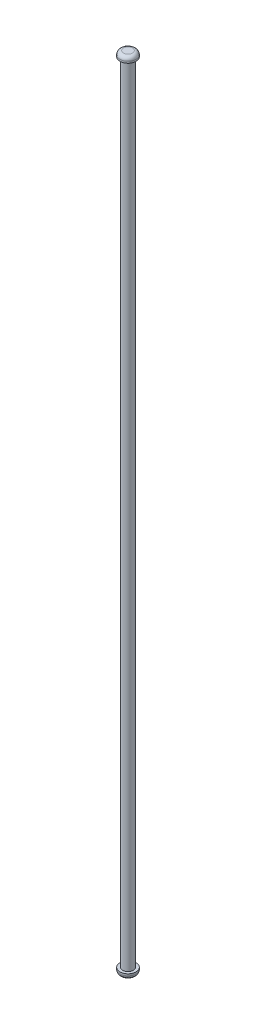
ISO-10303-21;
HEADER;
FILE_DESCRIPTION(('STEP AP214'),'2;1');
FILE_NAME('part.step','',(''),(''),'','','');
FILE_SCHEMA(('AUTOMOTIVE_DESIGN { 1 0 10303 214 1 1 1 1 }'));
ENDSEC;
DATA;
#1=APPLICATION_CONTEXT('core data for automotive mechanical design processes');
#2=APPLICATION_PROTOCOL_DEFINITION('international standard','automotive_design',2000,#1);
#3=PRODUCT_CONTEXT('',#1,'mechanical');
#4=PRODUCT('Part','Part','',(#3));
#5=PRODUCT_RELATED_PRODUCT_CATEGORY('part','',(#4));
#6=PRODUCT_DEFINITION_FORMATION('','',#4);
#7=PRODUCT_DEFINITION_CONTEXT('part definition',#1,'design');
#8=PRODUCT_DEFINITION('design','',#6,#7);
#9=PRODUCT_DEFINITION_SHAPE('','',#8);
#10=(LENGTH_UNIT() NAMED_UNIT(*) SI_UNIT(.MILLI.,.METRE.));
#11=(NAMED_UNIT(*) PLANE_ANGLE_UNIT() SI_UNIT($,.RADIAN.));
#12=(NAMED_UNIT(*) SI_UNIT($,.STERADIAN.) SOLID_ANGLE_UNIT());
#13=UNCERTAINTY_MEASURE_WITH_UNIT(LENGTH_MEASURE(1.E-05),#10,'distance_accuracy_value','');
#14=(GEOMETRIC_REPRESENTATION_CONTEXT(3) GLOBAL_UNCERTAINTY_ASSIGNED_CONTEXT((#13)) GLOBAL_UNIT_ASSIGNED_CONTEXT((#10,
#11,#12)) REPRESENTATION_CONTEXT('',''));
#15=CARTESIAN_POINT('',(0.,0.,0.));
#16=DIRECTION('',(0.,0.,1.));
#17=DIRECTION('',(1.,0.,0.));
#18=AXIS2_PLACEMENT_3D('',#15,#16,#17);
#19=CARTESIAN_POINT('',(-4.44089209850063E-13,224.,0.));
#20=DIRECTION('',(0.,-1.,0.));
#21=DIRECTION('',(0.,0.,-1.));
#22=AXIS2_PLACEMENT_3D('',#19,#20,#21);
#23=CYLINDRICAL_SURFACE('',#22,1.5);
#24=CARTESIAN_POINT('',(0.,222.5,0.));
#25=DIRECTION('',(0.,1.,0.));
#26=DIRECTION('',(0.,0.,1.));
#27=AXIS2_PLACEMENT_3D('',#24,#25,#26);
#28=CIRCLE('',#27,1.5);
#29=CARTESIAN_POINT('',(0.,222.5,1.5));
#30=VERTEX_POINT('',#29);
#31=EDGE_CURVE('E62',#30,#30,#28,.T.);
#32=ORIENTED_EDGE('',*,*,#31,.F.);
#33=EDGE_LOOP('',(#32));
#34=FACE_BOUND('',#33,.T.);
#35=CARTESIAN_POINT('',(-4.44089209850063E-13,1.50000000000006,0.));
#36=DIRECTION('',(0.,-1.,0.));
#37=DIRECTION('',(0.,0.,-1.));
#38=AXIS2_PLACEMENT_3D('',#35,#36,#37);
#39=CIRCLE('',#38,1.5);
#40=CARTESIAN_POINT('',(-4.44089209850063E-13,1.50000000000006,-1.5));
#41=VERTEX_POINT('',#40);
#42=EDGE_CURVE('E50',#41,#41,#39,.T.);
#43=ORIENTED_EDGE('',*,*,#42,.F.);
#44=EDGE_LOOP('',(#43));
#45=FACE_BOUND('',#44,.T.);
#46=ADVANCED_FACE('F39',(#34,#45),#23,.T.);
#47=CARTESIAN_POINT('',(0.,222.5,0.));
#48=DIRECTION('',(0.,1.,0.));
#49=DIRECTION('',(0.,0.,1.));
#50=AXIS2_PLACEMENT_3D('',#47,#48,#49);
#51=CYLINDRICAL_SURFACE('',#50,2.25);
#52=CARTESIAN_POINT('',(0.,223.,0.));
#53=DIRECTION('',(0.,1.,0.));
#54=DIRECTION('',(0.,0.,1.));
#55=AXIS2_PLACEMENT_3D('',#52,#53,#54);
#56=CIRCLE('',#55,2.25);
#57=CARTESIAN_POINT('',(0.,223.,2.25));
#58=VERTEX_POINT('',#57);
#59=EDGE_CURVE('E54',#58,#58,#56,.F.);
#60=ORIENTED_EDGE('',*,*,#59,.T.);
#61=EDGE_LOOP('',(#60));
#62=FACE_BOUND('',#61,.T.);
#63=CARTESIAN_POINT('',(0.,222.5,0.));
#64=DIRECTION('',(0.,1.,0.));
#65=DIRECTION('',(0.,0.,1.));
#66=AXIS2_PLACEMENT_3D('',#63,#64,#65);
#67=CIRCLE('',#66,2.25);
#68=CARTESIAN_POINT('',(0.,222.5,2.25));
#69=VERTEX_POINT('',#68);
#70=EDGE_CURVE('E65',#69,#69,#67,.T.);
#71=ORIENTED_EDGE('',*,*,#70,.T.);
#72=EDGE_LOOP('',(#71));
#73=FACE_BOUND('',#72,.T.);
#74=ADVANCED_FACE('F88',(#62,#73),#51,.T.);
#75=CARTESIAN_POINT('',(0.,222.5,0.));
#76=DIRECTION('',(0.,1.,0.));
#77=DIRECTION('',(0.,0.,1.));
#78=AXIS2_PLACEMENT_3D('',#75,#76,#77);
#79=PLANE('',#78);
#80=ORIENTED_EDGE('',*,*,#31,.T.);
#81=EDGE_LOOP('',(#80));
#82=FACE_BOUND('',#81,.T.);
#83=ORIENTED_EDGE('',*,*,#70,.F.);
#84=EDGE_LOOP('',(#83));
#85=FACE_BOUND('',#84,.T.);
#86=ADVANCED_FACE('F96',(#82,#85),#79,.F.);
#87=CARTESIAN_POINT('',(-4.44089209850063E-13,224.,0.));
#88=DIRECTION('',(0.,1.,0.));
#89=DIRECTION('',(0.,0.,1.));
#90=AXIS2_PLACEMENT_3D('',#87,#88,#89);
#91=PLANE('',#90);
#92=CARTESIAN_POINT('',(-4.44089209850063E-13,224.,0.));
#93=DIRECTION('',(0.,1.,0.));
#94=DIRECTION('',(0.,0.,1.));
#95=AXIS2_PLACEMENT_3D('',#92,#93,#94);
#96=CIRCLE('',#95,1.25);
#97=CARTESIAN_POINT('',(-4.44089209850063E-13,224.,1.25));
#98=VERTEX_POINT('',#97);
#99=EDGE_CURVE('E59',#98,#98,#96,.T.);
#100=ORIENTED_EDGE('',*,*,#99,.T.);
#101=EDGE_LOOP('',(#100));
#102=FACE_BOUND('',#101,.T.);
#103=ADVANCED_FACE('F102',(#102),#91,.T.);
#104=CARTESIAN_POINT('',(0.,223.,0.));
#105=DIRECTION('',(0.,1.,0.));
#106=DIRECTION('',(0.,0.,1.));
#107=AXIS2_PLACEMENT_3D('',#104,#105,#106);
#108=TOROIDAL_SURFACE('',#107,1.25,1.);
#109=ORIENTED_EDGE('',*,*,#59,.F.);
#110=EDGE_LOOP('',(#109));
#111=FACE_BOUND('',#110,.T.);
#112=ORIENTED_EDGE('',*,*,#99,.F.);
#113=EDGE_LOOP('',(#112));
#114=FACE_BOUND('',#113,.T.);
#115=ADVANCED_FACE('F85',(#111,#114),#108,.T.);
#116=CARTESIAN_POINT('',(-4.44089209850063E-13,1.49999999999995,0.));
#117=DIRECTION('',(0.,-1.,0.));
#118=DIRECTION('',(0.,0.,-1.));
#119=AXIS2_PLACEMENT_3D('',#116,#117,#118);
#120=CYLINDRICAL_SURFACE('',#119,2.25);
#121=CARTESIAN_POINT('',(-4.44089209850063E-13,1.,0.));
#122=DIRECTION('',(0.,1.,0.));
#123=DIRECTION('',(0.,0.,1.));
#124=AXIS2_PLACEMENT_3D('',#121,#122,#123);
#125=CIRCLE('',#124,2.25);
#126=CARTESIAN_POINT('',(-4.44089209850063E-13,1.,2.25));
#127=VERTEX_POINT('',#126);
#128=EDGE_CURVE('E10',#127,#127,#125,.T.);
#129=ORIENTED_EDGE('',*,*,#128,.T.);
#130=EDGE_LOOP('',(#129));
#131=FACE_BOUND('',#130,.T.);
#132=CARTESIAN_POINT('',(-4.44089209850063E-13,1.49999999999995,0.));
#133=DIRECTION('',(0.,-1.,0.));
#134=DIRECTION('',(0.,0.,-1.));
#135=AXIS2_PLACEMENT_3D('',#132,#133,#134);
#136=CIRCLE('',#135,2.25);
#137=CARTESIAN_POINT('',(-4.44089209850063E-13,1.49999999999995,-2.25));
#138=VERTEX_POINT('',#137);
#139=EDGE_CURVE('E68',#138,#138,#136,.T.);
#140=ORIENTED_EDGE('',*,*,#139,.T.);
#141=EDGE_LOOP('',(#140));
#142=FACE_BOUND('',#141,.T.);
#143=ADVANCED_FACE('F72',(#131,#142),#120,.T.);
#144=CARTESIAN_POINT('',(-4.44089209850063E-13,1.49999999999995,0.));
#145=DIRECTION('',(0.,-1.,0.));
#146=DIRECTION('',(0.,0.,-1.));
#147=AXIS2_PLACEMENT_3D('',#144,#145,#146);
#148=PLANE('',#147);
#149=ORIENTED_EDGE('',*,*,#42,.T.);
#150=EDGE_LOOP('',(#149));
#151=FACE_BOUND('',#150,.T.);
#152=ORIENTED_EDGE('',*,*,#139,.F.);
#153=EDGE_LOOP('',(#152));
#154=FACE_BOUND('',#153,.T.);
#155=ADVANCED_FACE('F74',(#151,#154),#148,.F.);
#156=CARTESIAN_POINT('',(0.,0.,0.));
#157=DIRECTION('',(0.,1.,0.));
#158=DIRECTION('',(0.,0.,1.));
#159=AXIS2_PLACEMENT_3D('',#156,#157,#158);
#160=PLANE('',#159);
#161=CARTESIAN_POINT('',(0.,0.,0.));
#162=DIRECTION('',(0.,1.,0.));
#163=DIRECTION('',(0.,0.,1.));
#164=AXIS2_PLACEMENT_3D('',#161,#162,#163);
#165=CIRCLE('',#164,1.25);
#166=CARTESIAN_POINT('',(0.,0.,1.25));
#167=VERTEX_POINT('',#166);
#168=EDGE_CURVE('E46',#167,#167,#165,.F.);
#169=ORIENTED_EDGE('',*,*,#168,.T.);
#170=EDGE_LOOP('',(#169));
#171=FACE_BOUND('',#170,.T.);
#172=ADVANCED_FACE('F76',(#171),#160,.F.);
#173=CARTESIAN_POINT('',(-4.44089209850063E-13,1.,0.));
#174=DIRECTION('',(0.,1.,0.));
#175=DIRECTION('',(0.,0.,1.));
#176=AXIS2_PLACEMENT_3D('',#173,#174,#175);
#177=TOROIDAL_SURFACE('',#176,1.25,1.);
#178=ORIENTED_EDGE('',*,*,#128,.F.);
#179=EDGE_LOOP('',(#178));
#180=FACE_BOUND('',#179,.T.);
#181=ORIENTED_EDGE('',*,*,#168,.F.);
#182=EDGE_LOOP('',(#181));
#183=FACE_BOUND('',#182,.T.);
#184=ADVANCED_FACE('F41',(#180,#183),#177,.T.);
#185=CLOSED_SHELL('',(#46,#74,#86,#103,#115,#143,#155,#172,#184));
#186=MANIFOLD_SOLID_BREP('B2',#185);
#187=ADVANCED_BREP_SHAPE_REPRESENTATION('',(#18,#186),#14);
#188=SHAPE_DEFINITION_REPRESENTATION(#9,#187);
ENDSEC;
END-ISO-10303-21;
